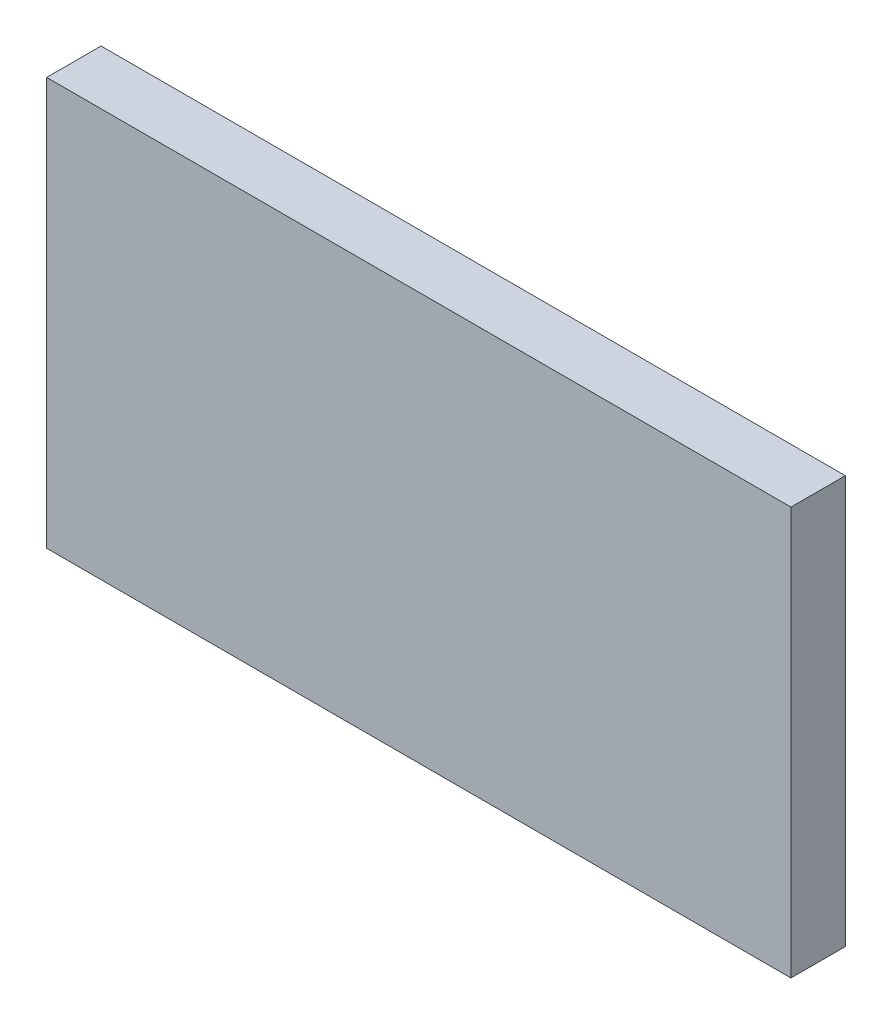
ISO-10303-21;
HEADER;
FILE_DESCRIPTION(('STEP AP214'),'2;1');
FILE_NAME('part.step','',(''),(''),'','','');
FILE_SCHEMA(('AUTOMOTIVE_DESIGN { 1 0 10303 214 1 1 1 1 }'));
ENDSEC;
DATA;
#1=APPLICATION_CONTEXT('core data for automotive mechanical design processes');
#2=APPLICATION_PROTOCOL_DEFINITION('international standard','automotive_design',2000,#1);
#3=PRODUCT_CONTEXT('',#1,'mechanical');
#4=PRODUCT('Part','Part','',(#3));
#5=PRODUCT_RELATED_PRODUCT_CATEGORY('part','',(#4));
#6=PRODUCT_DEFINITION_FORMATION('','',#4);
#7=PRODUCT_DEFINITION_CONTEXT('part definition',#1,'design');
#8=PRODUCT_DEFINITION('design','',#6,#7);
#9=PRODUCT_DEFINITION_SHAPE('','',#8);
#10=(LENGTH_UNIT() NAMED_UNIT(*) SI_UNIT(.MILLI.,.METRE.));
#11=(NAMED_UNIT(*) PLANE_ANGLE_UNIT() SI_UNIT($,.RADIAN.));
#12=(NAMED_UNIT(*) SI_UNIT($,.STERADIAN.) SOLID_ANGLE_UNIT());
#13=UNCERTAINTY_MEASURE_WITH_UNIT(LENGTH_MEASURE(1.E-05),#10,'distance_accuracy_value','');
#14=(GEOMETRIC_REPRESENTATION_CONTEXT(3) GLOBAL_UNCERTAINTY_ASSIGNED_CONTEXT((#13)) GLOBAL_UNIT_ASSIGNED_CONTEXT((#10,
#11,#12)) REPRESENTATION_CONTEXT('',''));
#15=CARTESIAN_POINT('',(0.,0.,0.));
#16=DIRECTION('',(0.,0.,1.));
#17=DIRECTION('',(1.,0.,0.));
#18=AXIS2_PLACEMENT_3D('',#15,#16,#17);
#19=CARTESIAN_POINT('',(-20.0525,15.5175,1.1585));
#20=DIRECTION('',(1.,0.,0.));
#21=DIRECTION('',(0.,0.,-1.));
#22=AXIS2_PLACEMENT_3D('',#19,#20,#21);
#23=PLANE('',#22);
#24=DIRECTION('',(0.,-1.,0.));
#25=VECTOR('',#24,1.);
#26=CARTESIAN_POINT('',(-20.0525,15.5175,-1.1585));
#27=LINE('',#26,#25);
#28=CARTESIAN_POINT('',(-20.0525,15.5175,-1.1585));
#29=VERTEX_POINT('',#28);
#30=CARTESIAN_POINT('',(-20.0525,-1.8635,-1.1585));
#31=VERTEX_POINT('',#30);
#32=EDGE_CURVE('E101',#29,#31,#27,.T.);
#33=ORIENTED_EDGE('',*,*,#32,.T.);
#34=DIRECTION('',(0.,0.,-1.));
#35=VECTOR('',#34,1.);
#36=CARTESIAN_POINT('',(-20.0525,-1.8635,1.1585));
#37=LINE('',#36,#35);
#38=CARTESIAN_POINT('',(-20.0525,-1.8635,1.1585));
#39=VERTEX_POINT('',#38);
#40=EDGE_CURVE('E11',#39,#31,#37,.T.);
#41=ORIENTED_EDGE('',*,*,#40,.F.);
#42=DIRECTION('',(0.,-1.,0.));
#43=VECTOR('',#42,1.);
#44=CARTESIAN_POINT('',(-20.0525,15.5175,1.1585));
#45=LINE('',#44,#43);
#46=CARTESIAN_POINT('',(-20.0525,15.5175,1.1585));
#47=VERTEX_POINT('',#46);
#48=EDGE_CURVE('E95',#47,#39,#45,.T.);
#49=ORIENTED_EDGE('',*,*,#48,.F.);
#50=DIRECTION('',(0.,0.,-1.));
#51=VECTOR('',#50,1.);
#52=CARTESIAN_POINT('',(-20.0525,15.5175,1.1585));
#53=LINE('',#52,#51);
#54=EDGE_CURVE('E99',#47,#29,#53,.T.);
#55=ORIENTED_EDGE('',*,*,#54,.T.);
#56=EDGE_LOOP('',(#33,#41,#49,#55));
#57=FACE_BOUND('',#56,.T.);
#58=ADVANCED_FACE('F41',(#57),#23,.F.);
#59=CARTESIAN_POINT('',(-20.0525,-1.8635,1.1585));
#60=DIRECTION('',(0.,1.,0.));
#61=DIRECTION('',(0.,0.,1.));
#62=AXIS2_PLACEMENT_3D('',#59,#60,#61);
#63=PLANE('',#62);
#64=DIRECTION('',(1.,0.,0.));
#65=VECTOR('',#64,1.);
#66=CARTESIAN_POINT('',(-20.0525,-1.8635,-1.1585));
#67=LINE('',#66,#65);
#68=CARTESIAN_POINT('',(11.6665,-1.8635,-1.1585));
#69=VERTEX_POINT('',#68);
#70=EDGE_CURVE('E96',#31,#69,#67,.T.);
#71=ORIENTED_EDGE('',*,*,#70,.T.);
#72=DIRECTION('',(0.,0.,-1.));
#73=VECTOR('',#72,1.);
#74=CARTESIAN_POINT('',(11.6665,-1.8635,1.1585));
#75=LINE('',#74,#73);
#76=CARTESIAN_POINT('',(11.6665,-1.8635,1.1585));
#77=VERTEX_POINT('',#76);
#78=EDGE_CURVE('E47',#77,#69,#75,.T.);
#79=ORIENTED_EDGE('',*,*,#78,.F.);
#80=DIRECTION('',(1.,0.,0.));
#81=VECTOR('',#80,1.);
#82=CARTESIAN_POINT('',(-20.0525,-1.8635,1.1585));
#83=LINE('',#82,#81);
#84=EDGE_CURVE('E90',#39,#77,#83,.T.);
#85=ORIENTED_EDGE('',*,*,#84,.F.);
#86=ORIENTED_EDGE('',*,*,#40,.T.);
#87=EDGE_LOOP('',(#71,#79,#85,#86));
#88=FACE_BOUND('',#87,.T.);
#89=ADVANCED_FACE('F94',(#88),#63,.F.);
#90=CARTESIAN_POINT('',(11.6665,-1.8635,1.1585));
#91=DIRECTION('',(-1.,0.,0.));
#92=DIRECTION('',(0.,0.,1.));
#93=AXIS2_PLACEMENT_3D('',#90,#91,#92);
#94=PLANE('',#93);
#95=DIRECTION('',(0.,1.,0.));
#96=VECTOR('',#95,1.);
#97=CARTESIAN_POINT('',(11.6665,-1.8635,-1.1585));
#98=LINE('',#97,#96);
#99=CARTESIAN_POINT('',(11.6665,15.5175,-1.1585));
#100=VERTEX_POINT('',#99);
#101=EDGE_CURVE('E71',#69,#100,#98,.T.);
#102=ORIENTED_EDGE('',*,*,#101,.T.);
#103=DIRECTION('',(0.,0.,-1.));
#104=VECTOR('',#103,1.);
#105=CARTESIAN_POINT('',(11.6665,15.5175,1.1585));
#106=LINE('',#105,#104);
#107=CARTESIAN_POINT('',(11.6665,15.5175,1.1585));
#108=VERTEX_POINT('',#107);
#109=EDGE_CURVE('E100',#108,#100,#106,.T.);
#110=ORIENTED_EDGE('',*,*,#109,.F.);
#111=DIRECTION('',(0.,1.,0.));
#112=VECTOR('',#111,1.);
#113=CARTESIAN_POINT('',(11.6665,-1.8635,1.1585));
#114=LINE('',#113,#112);
#115=EDGE_CURVE('E89',#77,#108,#114,.T.);
#116=ORIENTED_EDGE('',*,*,#115,.F.);
#117=ORIENTED_EDGE('',*,*,#78,.T.);
#118=EDGE_LOOP('',(#102,#110,#116,#117));
#119=FACE_BOUND('',#118,.T.);
#120=ADVANCED_FACE('F97',(#119),#94,.F.);
#121=CARTESIAN_POINT('',(11.6665,15.5175,1.1585));
#122=DIRECTION('',(0.,-1.,0.));
#123=DIRECTION('',(0.,0.,-1.));
#124=AXIS2_PLACEMENT_3D('',#121,#122,#123);
#125=PLANE('',#124);
#126=DIRECTION('',(-1.,0.,0.));
#127=VECTOR('',#126,1.);
#128=CARTESIAN_POINT('',(11.6665,15.5175,-1.1585));
#129=LINE('',#128,#127);
#130=EDGE_CURVE('E79',#100,#29,#129,.T.);
#131=ORIENTED_EDGE('',*,*,#130,.T.);
#132=ORIENTED_EDGE('',*,*,#54,.F.);
#133=DIRECTION('',(-1.,0.,0.));
#134=VECTOR('',#133,1.);
#135=CARTESIAN_POINT('',(11.6665,15.5175,1.1585));
#136=LINE('',#135,#134);
#137=EDGE_CURVE('E60',#108,#47,#136,.T.);
#138=ORIENTED_EDGE('',*,*,#137,.F.);
#139=ORIENTED_EDGE('',*,*,#109,.T.);
#140=EDGE_LOOP('',(#131,#132,#138,#139));
#141=FACE_BOUND('',#140,.T.);
#142=ADVANCED_FACE('F112',(#141),#125,.F.);
#143=CARTESIAN_POINT('',(0.,0.,1.1585));
#144=DIRECTION('',(0.,0.,1.));
#145=DIRECTION('',(1.,0.,0.));
#146=AXIS2_PLACEMENT_3D('',#143,#144,#145);
#147=PLANE('',#146);
#148=ORIENTED_EDGE('',*,*,#48,.T.);
#149=ORIENTED_EDGE('',*,*,#84,.T.);
#150=ORIENTED_EDGE('',*,*,#115,.T.);
#151=ORIENTED_EDGE('',*,*,#137,.T.);
#152=EDGE_LOOP('',(#148,#149,#150,#151));
#153=FACE_BOUND('',#152,.T.);
#154=ADVANCED_FACE('F88',(#153),#147,.T.);
#155=CARTESIAN_POINT('',(0.,0.,-1.1585));
#156=DIRECTION('',(0.,0.,1.));
#157=DIRECTION('',(1.,0.,0.));
#158=AXIS2_PLACEMENT_3D('',#155,#156,#157);
#159=PLANE('',#158);
#160=ORIENTED_EDGE('',*,*,#32,.F.);
#161=ORIENTED_EDGE('',*,*,#130,.F.);
#162=ORIENTED_EDGE('',*,*,#101,.F.);
#163=ORIENTED_EDGE('',*,*,#70,.F.);
#164=EDGE_LOOP('',(#160,#161,#162,#163));
#165=FACE_BOUND('',#164,.T.);
#166=ADVANCED_FACE('F114',(#165),#159,.F.);
#167=CLOSED_SHELL('',(#58,#89,#120,#142,#154,#166));
#168=MANIFOLD_SOLID_BREP('B2',#167);
#169=ADVANCED_BREP_SHAPE_REPRESENTATION('',(#18,#168),#14);
#170=SHAPE_DEFINITION_REPRESENTATION(#9,#169);
ENDSEC;
END-ISO-10303-21;
